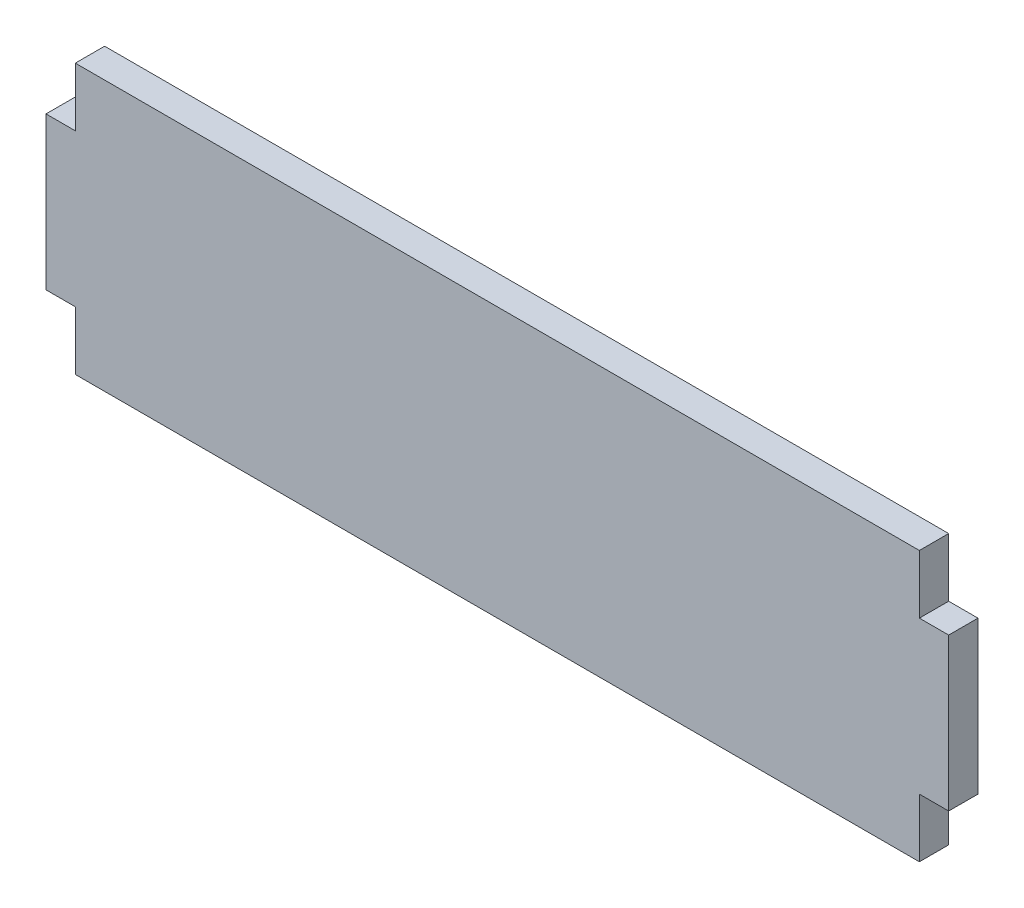
ISO-10303-21;
HEADER;
FILE_DESCRIPTION(('STEP AP214'),'2;1');
FILE_NAME('part.step','',(''),(''),'','','');
FILE_SCHEMA(('AUTOMOTIVE_DESIGN { 1 0 10303 214 1 1 1 1 }'));
ENDSEC;
DATA;
#1=APPLICATION_CONTEXT('core data for automotive mechanical design processes');
#2=APPLICATION_PROTOCOL_DEFINITION('international standard','automotive_design',2000,#1);
#3=PRODUCT_CONTEXT('',#1,'mechanical');
#4=PRODUCT('Part','Part','',(#3));
#5=PRODUCT_RELATED_PRODUCT_CATEGORY('part','',(#4));
#6=PRODUCT_DEFINITION_FORMATION('','',#4);
#7=PRODUCT_DEFINITION_CONTEXT('part definition',#1,'design');
#8=PRODUCT_DEFINITION('design','',#6,#7);
#9=PRODUCT_DEFINITION_SHAPE('','',#8);
#10=(LENGTH_UNIT() NAMED_UNIT(*) SI_UNIT(.MILLI.,.METRE.));
#11=(NAMED_UNIT(*) PLANE_ANGLE_UNIT() SI_UNIT($,.RADIAN.));
#12=(NAMED_UNIT(*) SI_UNIT($,.STERADIAN.) SOLID_ANGLE_UNIT());
#13=UNCERTAINTY_MEASURE_WITH_UNIT(LENGTH_MEASURE(1.E-05),#10,'distance_accuracy_value','');
#14=(GEOMETRIC_REPRESENTATION_CONTEXT(3) GLOBAL_UNCERTAINTY_ASSIGNED_CONTEXT((#13)) GLOBAL_UNIT_ASSIGNED_CONTEXT((#10,
#11,#12)) REPRESENTATION_CONTEXT('',''));
#15=CARTESIAN_POINT('',(0.,0.,0.));
#16=DIRECTION('',(0.,0.,1.));
#17=DIRECTION('',(1.,0.,0.));
#18=AXIS2_PLACEMENT_3D('',#15,#16,#17);
#19=CARTESIAN_POINT('',(-72.,23.,5.));
#20=DIRECTION('',(1.,0.,0.));
#21=DIRECTION('',(0.,0.,-1.));
#22=AXIS2_PLACEMENT_3D('',#19,#20,#21);
#23=PLANE('',#22);
#24=DIRECTION('',(0.,-1.,0.));
#25=VECTOR('',#24,1.);
#26=CARTESIAN_POINT('',(-72.,23.,0.));
#27=LINE('',#26,#25);
#28=CARTESIAN_POINT('',(-72.,23.,0.));
#29=VERTEX_POINT('',#28);
#30=CARTESIAN_POINT('',(-72.,13.,0.));
#31=VERTEX_POINT('',#30);
#32=EDGE_CURVE('E157',#29,#31,#27,.T.);
#33=ORIENTED_EDGE('',*,*,#32,.T.);
#34=DIRECTION('',(0.,0.,-1.));
#35=VECTOR('',#34,1.);
#36=CARTESIAN_POINT('',(-72.,13.,5.));
#37=LINE('',#36,#35);
#38=CARTESIAN_POINT('',(-72.,13.,5.));
#39=VERTEX_POINT('',#38);
#40=EDGE_CURVE('E11',#39,#31,#37,.T.);
#41=ORIENTED_EDGE('',*,*,#40,.F.);
#42=DIRECTION('',(0.,-1.,0.));
#43=VECTOR('',#42,1.);
#44=CARTESIAN_POINT('',(-72.,23.,5.));
#45=LINE('',#44,#43);
#46=CARTESIAN_POINT('',(-72.,23.,5.));
#47=VERTEX_POINT('',#46);
#48=EDGE_CURVE('E179',#47,#39,#45,.T.);
#49=ORIENTED_EDGE('',*,*,#48,.F.);
#50=DIRECTION('',(0.,0.,-1.));
#51=VECTOR('',#50,1.);
#52=CARTESIAN_POINT('',(-72.,23.,5.));
#53=LINE('',#52,#51);
#54=EDGE_CURVE('E153',#47,#29,#53,.T.);
#55=ORIENTED_EDGE('',*,*,#54,.T.);
#56=EDGE_LOOP('',(#33,#41,#49,#55));
#57=FACE_BOUND('',#56,.T.);
#58=ADVANCED_FACE('F37',(#57),#23,.F.);
#59=CARTESIAN_POINT('',(-72.,13.,5.));
#60=DIRECTION('',(0.,-1.,0.));
#61=DIRECTION('',(0.,0.,-1.));
#62=AXIS2_PLACEMENT_3D('',#59,#60,#61);
#63=PLANE('',#62);
#64=DIRECTION('',(-1.,0.,0.));
#65=VECTOR('',#64,1.);
#66=CARTESIAN_POINT('',(-72.,13.,0.));
#67=LINE('',#66,#65);
#68=CARTESIAN_POINT('',(-77.,13.,0.));
#69=VERTEX_POINT('',#68);
#70=EDGE_CURVE('E160',#31,#69,#67,.T.);
#71=ORIENTED_EDGE('',*,*,#70,.T.);
#72=DIRECTION('',(0.,0.,-1.));
#73=VECTOR('',#72,1.);
#74=CARTESIAN_POINT('',(-77.,13.,5.));
#75=LINE('',#74,#73);
#76=CARTESIAN_POINT('',(-77.,13.,5.));
#77=VERTEX_POINT('',#76);
#78=EDGE_CURVE('E45',#77,#69,#75,.T.);
#79=ORIENTED_EDGE('',*,*,#78,.F.);
#80=DIRECTION('',(-1.,0.,0.));
#81=VECTOR('',#80,1.);
#82=CARTESIAN_POINT('',(-72.,13.,5.));
#83=LINE('',#82,#81);
#84=EDGE_CURVE('E108',#39,#77,#83,.T.);
#85=ORIENTED_EDGE('',*,*,#84,.F.);
#86=ORIENTED_EDGE('',*,*,#40,.T.);
#87=EDGE_LOOP('',(#71,#79,#85,#86));
#88=FACE_BOUND('',#87,.T.);
#89=ADVANCED_FACE('F257',(#88),#63,.F.);
#90=CARTESIAN_POINT('',(-77.,13.,5.));
#91=DIRECTION('',(1.,0.,0.));
#92=DIRECTION('',(0.,0.,-1.));
#93=AXIS2_PLACEMENT_3D('',#90,#91,#92);
#94=PLANE('',#93);
#95=DIRECTION('',(0.,-1.,0.));
#96=VECTOR('',#95,1.);
#97=CARTESIAN_POINT('',(-77.,13.,0.));
#98=LINE('',#97,#96);
#99=CARTESIAN_POINT('',(-77.,-13.,0.));
#100=VERTEX_POINT('',#99);
#101=EDGE_CURVE('E162',#69,#100,#98,.T.);
#102=ORIENTED_EDGE('',*,*,#101,.T.);
#103=DIRECTION('',(0.,0.,-1.));
#104=VECTOR('',#103,1.);
#105=CARTESIAN_POINT('',(-77.,-13.,5.));
#106=LINE('',#105,#104);
#107=CARTESIAN_POINT('',(-77.,-13.,5.));
#108=VERTEX_POINT('',#107);
#109=EDGE_CURVE('E198',#108,#100,#106,.T.);
#110=ORIENTED_EDGE('',*,*,#109,.F.);
#111=DIRECTION('',(0.,-1.,0.));
#112=VECTOR('',#111,1.);
#113=CARTESIAN_POINT('',(-77.,13.,5.));
#114=LINE('',#113,#112);
#115=EDGE_CURVE('E206',#77,#108,#114,.T.);
#116=ORIENTED_EDGE('',*,*,#115,.F.);
#117=ORIENTED_EDGE('',*,*,#78,.T.);
#118=EDGE_LOOP('',(#102,#110,#116,#117));
#119=FACE_BOUND('',#118,.T.);
#120=ADVANCED_FACE('F204',(#119),#94,.F.);
#121=CARTESIAN_POINT('',(-77.,-13.,5.));
#122=DIRECTION('',(0.,1.,0.));
#123=DIRECTION('',(0.,0.,1.));
#124=AXIS2_PLACEMENT_3D('',#121,#122,#123);
#125=PLANE('',#124);
#126=DIRECTION('',(1.,0.,0.));
#127=VECTOR('',#126,1.);
#128=CARTESIAN_POINT('',(-77.,-13.,0.));
#129=LINE('',#128,#127);
#130=CARTESIAN_POINT('',(-72.,-13.,0.));
#131=VERTEX_POINT('',#130);
#132=EDGE_CURVE('E164',#100,#131,#129,.T.);
#133=ORIENTED_EDGE('',*,*,#132,.T.);
#134=DIRECTION('',(0.,0.,-1.));
#135=VECTOR('',#134,1.);
#136=CARTESIAN_POINT('',(-72.,-13.,5.));
#137=LINE('',#136,#135);
#138=CARTESIAN_POINT('',(-72.,-13.,5.));
#139=VERTEX_POINT('',#138);
#140=EDGE_CURVE('E195',#139,#131,#137,.T.);
#141=ORIENTED_EDGE('',*,*,#140,.F.);
#142=DIRECTION('',(1.,0.,0.));
#143=VECTOR('',#142,1.);
#144=CARTESIAN_POINT('',(-77.,-13.,5.));
#145=LINE('',#144,#143);
#146=EDGE_CURVE('E224',#108,#139,#145,.T.);
#147=ORIENTED_EDGE('',*,*,#146,.F.);
#148=ORIENTED_EDGE('',*,*,#109,.T.);
#149=EDGE_LOOP('',(#133,#141,#147,#148));
#150=FACE_BOUND('',#149,.T.);
#151=ADVANCED_FACE('F215',(#150),#125,.F.);
#152=CARTESIAN_POINT('',(-72.,-13.,5.));
#153=DIRECTION('',(1.,0.,0.));
#154=DIRECTION('',(0.,0.,-1.));
#155=AXIS2_PLACEMENT_3D('',#152,#153,#154);
#156=PLANE('',#155);
#157=DIRECTION('',(0.,-1.,0.));
#158=VECTOR('',#157,1.);
#159=CARTESIAN_POINT('',(-72.,-13.,0.));
#160=LINE('',#159,#158);
#161=CARTESIAN_POINT('',(-72.,-23.,0.));
#162=VERTEX_POINT('',#161);
#163=EDGE_CURVE('E166',#131,#162,#160,.T.);
#164=ORIENTED_EDGE('',*,*,#163,.T.);
#165=DIRECTION('',(0.,0.,-1.));
#166=VECTOR('',#165,1.);
#167=CARTESIAN_POINT('',(-72.,-23.,5.));
#168=LINE('',#167,#166);
#169=CARTESIAN_POINT('',(-72.,-23.,5.));
#170=VERTEX_POINT('',#169);
#171=EDGE_CURVE('E192',#170,#162,#168,.T.);
#172=ORIENTED_EDGE('',*,*,#171,.F.);
#173=DIRECTION('',(0.,-1.,0.));
#174=VECTOR('',#173,1.);
#175=CARTESIAN_POINT('',(-72.,-13.,5.));
#176=LINE('',#175,#174);
#177=EDGE_CURVE('E221',#139,#170,#176,.T.);
#178=ORIENTED_EDGE('',*,*,#177,.F.);
#179=ORIENTED_EDGE('',*,*,#140,.T.);
#180=EDGE_LOOP('',(#164,#172,#178,#179));
#181=FACE_BOUND('',#180,.T.);
#182=ADVANCED_FACE('F219',(#181),#156,.F.);
#183=CARTESIAN_POINT('',(72.,-23.,5.));
#184=DIRECTION('',(0.,1.,0.));
#185=DIRECTION('',(0.,0.,1.));
#186=AXIS2_PLACEMENT_3D('',#183,#184,#185);
#187=PLANE('',#186);
#188=DIRECTION('',(1.,0.,0.));
#189=VECTOR('',#188,1.);
#190=CARTESIAN_POINT('',(72.,-23.,0.));
#191=LINE('',#190,#189);
#192=CARTESIAN_POINT('',(72.,-23.,0.));
#193=VERTEX_POINT('',#192);
#194=EDGE_CURVE('E168',#162,#193,#191,.T.);
#195=ORIENTED_EDGE('',*,*,#194,.T.);
#196=DIRECTION('',(0.,0.,-1.));
#197=VECTOR('',#196,1.);
#198=CARTESIAN_POINT('',(72.,-23.,5.));
#199=LINE('',#198,#197);
#200=CARTESIAN_POINT('',(72.,-23.,5.));
#201=VERTEX_POINT('',#200);
#202=EDGE_CURVE('E189',#201,#193,#199,.T.);
#203=ORIENTED_EDGE('',*,*,#202,.F.);
#204=DIRECTION('',(1.,0.,0.));
#205=VECTOR('',#204,1.);
#206=CARTESIAN_POINT('',(72.,-23.,5.));
#207=LINE('',#206,#205);
#208=EDGE_CURVE('E223',#170,#201,#207,.T.);
#209=ORIENTED_EDGE('',*,*,#208,.F.);
#210=ORIENTED_EDGE('',*,*,#171,.T.);
#211=EDGE_LOOP('',(#195,#203,#209,#210));
#212=FACE_BOUND('',#211,.T.);
#213=ADVANCED_FACE('F270',(#212),#187,.F.);
#214=CARTESIAN_POINT('',(72.,-13.,5.));
#215=DIRECTION('',(-1.,0.,0.));
#216=DIRECTION('',(0.,0.,1.));
#217=AXIS2_PLACEMENT_3D('',#214,#215,#216);
#218=PLANE('',#217);
#219=DIRECTION('',(0.,1.,0.));
#220=VECTOR('',#219,1.);
#221=CARTESIAN_POINT('',(72.,-13.,0.));
#222=LINE('',#221,#220);
#223=CARTESIAN_POINT('',(72.,-13.,0.));
#224=VERTEX_POINT('',#223);
#225=EDGE_CURVE('E170',#193,#224,#222,.T.);
#226=ORIENTED_EDGE('',*,*,#225,.T.);
#227=DIRECTION('',(0.,0.,-1.));
#228=VECTOR('',#227,1.);
#229=CARTESIAN_POINT('',(72.,-13.,5.));
#230=LINE('',#229,#228);
#231=CARTESIAN_POINT('',(72.,-13.,5.));
#232=VERTEX_POINT('',#231);
#233=EDGE_CURVE('E186',#232,#224,#230,.T.);
#234=ORIENTED_EDGE('',*,*,#233,.F.);
#235=DIRECTION('',(0.,1.,0.));
#236=VECTOR('',#235,1.);
#237=CARTESIAN_POINT('',(72.,-13.,5.));
#238=LINE('',#237,#236);
#239=EDGE_CURVE('E226',#201,#232,#238,.T.);
#240=ORIENTED_EDGE('',*,*,#239,.F.);
#241=ORIENTED_EDGE('',*,*,#202,.T.);
#242=EDGE_LOOP('',(#226,#234,#240,#241));
#243=FACE_BOUND('',#242,.T.);
#244=ADVANCED_FACE('F273',(#243),#218,.F.);
#245=CARTESIAN_POINT('',(77.,-13.,5.));
#246=DIRECTION('',(0.,1.,0.));
#247=DIRECTION('',(0.,0.,1.));
#248=AXIS2_PLACEMENT_3D('',#245,#246,#247);
#249=PLANE('',#248);
#250=DIRECTION('',(1.,0.,0.));
#251=VECTOR('',#250,1.);
#252=CARTESIAN_POINT('',(77.,-13.,0.));
#253=LINE('',#252,#251);
#254=CARTESIAN_POINT('',(77.,-13.,0.));
#255=VERTEX_POINT('',#254);
#256=EDGE_CURVE('E172',#224,#255,#253,.T.);
#257=ORIENTED_EDGE('',*,*,#256,.T.);
#258=DIRECTION('',(0.,0.,-1.));
#259=VECTOR('',#258,1.);
#260=CARTESIAN_POINT('',(77.,-13.,5.));
#261=LINE('',#260,#259);
#262=CARTESIAN_POINT('',(77.,-13.,5.));
#263=VERTEX_POINT('',#262);
#264=EDGE_CURVE('E183',#263,#255,#261,.T.);
#265=ORIENTED_EDGE('',*,*,#264,.F.);
#266=DIRECTION('',(1.,0.,0.));
#267=VECTOR('',#266,1.);
#268=CARTESIAN_POINT('',(77.,-13.,5.));
#269=LINE('',#268,#267);
#270=EDGE_CURVE('E232',#232,#263,#269,.T.);
#271=ORIENTED_EDGE('',*,*,#270,.F.);
#272=ORIENTED_EDGE('',*,*,#233,.T.);
#273=EDGE_LOOP('',(#257,#265,#271,#272));
#274=FACE_BOUND('',#273,.T.);
#275=ADVANCED_FACE('F238',(#274),#249,.F.);
#276=CARTESIAN_POINT('',(77.,13.,5.));
#277=DIRECTION('',(-1.,0.,0.));
#278=DIRECTION('',(0.,0.,1.));
#279=AXIS2_PLACEMENT_3D('',#276,#277,#278);
#280=PLANE('',#279);
#281=DIRECTION('',(0.,1.,0.));
#282=VECTOR('',#281,1.);
#283=CARTESIAN_POINT('',(77.,13.,0.));
#284=LINE('',#283,#282);
#285=CARTESIAN_POINT('',(77.,13.,0.));
#286=VERTEX_POINT('',#285);
#287=EDGE_CURVE('E174',#255,#286,#284,.T.);
#288=ORIENTED_EDGE('',*,*,#287,.T.);
#289=DIRECTION('',(0.,0.,-1.));
#290=VECTOR('',#289,1.);
#291=CARTESIAN_POINT('',(77.,13.,5.));
#292=LINE('',#291,#290);
#293=CARTESIAN_POINT('',(77.,13.,5.));
#294=VERTEX_POINT('',#293);
#295=EDGE_CURVE('E148',#294,#286,#292,.T.);
#296=ORIENTED_EDGE('',*,*,#295,.F.);
#297=DIRECTION('',(0.,1.,0.));
#298=VECTOR('',#297,1.);
#299=CARTESIAN_POINT('',(77.,13.,5.));
#300=LINE('',#299,#298);
#301=EDGE_CURVE('E139',#263,#294,#300,.T.);
#302=ORIENTED_EDGE('',*,*,#301,.F.);
#303=ORIENTED_EDGE('',*,*,#264,.T.);
#304=EDGE_LOOP('',(#288,#296,#302,#303));
#305=FACE_BOUND('',#304,.T.);
#306=ADVANCED_FACE('F242',(#305),#280,.F.);
#307=CARTESIAN_POINT('',(72.,13.,5.));
#308=DIRECTION('',(0.,-1.,0.));
#309=DIRECTION('',(0.,0.,-1.));
#310=AXIS2_PLACEMENT_3D('',#307,#308,#309);
#311=PLANE('',#310);
#312=DIRECTION('',(-1.,0.,0.));
#313=VECTOR('',#312,1.);
#314=CARTESIAN_POINT('',(72.,13.,0.));
#315=LINE('',#314,#313);
#316=CARTESIAN_POINT('',(72.,13.,0.));
#317=VERTEX_POINT('',#316);
#318=EDGE_CURVE('E147',#286,#317,#315,.T.);
#319=ORIENTED_EDGE('',*,*,#318,.T.);
#320=DIRECTION('',(0.,0.,-1.));
#321=VECTOR('',#320,1.);
#322=CARTESIAN_POINT('',(72.,13.,5.));
#323=LINE('',#322,#321);
#324=CARTESIAN_POINT('',(72.,13.,5.));
#325=VERTEX_POINT('',#324);
#326=EDGE_CURVE('E144',#325,#317,#323,.T.);
#327=ORIENTED_EDGE('',*,*,#326,.F.);
#328=DIRECTION('',(-1.,0.,0.));
#329=VECTOR('',#328,1.);
#330=CARTESIAN_POINT('',(72.,13.,5.));
#331=LINE('',#330,#329);
#332=EDGE_CURVE('E133',#294,#325,#331,.T.);
#333=ORIENTED_EDGE('',*,*,#332,.F.);
#334=ORIENTED_EDGE('',*,*,#295,.T.);
#335=EDGE_LOOP('',(#319,#327,#333,#334));
#336=FACE_BOUND('',#335,.T.);
#337=ADVANCED_FACE('F145',(#336),#311,.F.);
#338=CARTESIAN_POINT('',(72.,23.,5.));
#339=DIRECTION('',(-1.,0.,0.));
#340=DIRECTION('',(0.,0.,1.));
#341=AXIS2_PLACEMENT_3D('',#338,#339,#340);
#342=PLANE('',#341);
#343=DIRECTION('',(0.,1.,0.));
#344=VECTOR('',#343,1.);
#345=CARTESIAN_POINT('',(72.,23.,0.));
#346=LINE('',#345,#344);
#347=CARTESIAN_POINT('',(72.,23.,0.));
#348=VERTEX_POINT('',#347);
#349=EDGE_CURVE('E94',#317,#348,#346,.T.);
#350=ORIENTED_EDGE('',*,*,#349,.T.);
#351=DIRECTION('',(0.,0.,-1.));
#352=VECTOR('',#351,1.);
#353=CARTESIAN_POINT('',(72.,23.,5.));
#354=LINE('',#353,#352);
#355=CARTESIAN_POINT('',(72.,23.,5.));
#356=VERTEX_POINT('',#355);
#357=EDGE_CURVE('E149',#356,#348,#354,.T.);
#358=ORIENTED_EDGE('',*,*,#357,.F.);
#359=DIRECTION('',(0.,1.,0.));
#360=VECTOR('',#359,1.);
#361=CARTESIAN_POINT('',(72.,23.,5.));
#362=LINE('',#361,#360);
#363=EDGE_CURVE('E137',#325,#356,#362,.T.);
#364=ORIENTED_EDGE('',*,*,#363,.F.);
#365=ORIENTED_EDGE('',*,*,#326,.T.);
#366=EDGE_LOOP('',(#350,#358,#364,#365));
#367=FACE_BOUND('',#366,.T.);
#368=ADVANCED_FACE('F151',(#367),#342,.F.);
#369=CARTESIAN_POINT('',(-72.,23.,5.));
#370=DIRECTION('',(0.,-1.,0.));
#371=DIRECTION('',(0.,0.,-1.));
#372=AXIS2_PLACEMENT_3D('',#369,#370,#371);
#373=PLANE('',#372);
#374=DIRECTION('',(-1.,0.,0.));
#375=VECTOR('',#374,1.);
#376=CARTESIAN_POINT('',(-72.,23.,0.));
#377=LINE('',#376,#375);
#378=EDGE_CURVE('E100',#348,#29,#377,.T.);
#379=ORIENTED_EDGE('',*,*,#378,.T.);
#380=ORIENTED_EDGE('',*,*,#54,.F.);
#381=DIRECTION('',(-1.,0.,0.));
#382=VECTOR('',#381,1.);
#383=CARTESIAN_POINT('',(-72.,23.,5.));
#384=LINE('',#383,#382);
#385=EDGE_CURVE('E53',#356,#47,#384,.T.);
#386=ORIENTED_EDGE('',*,*,#385,.F.);
#387=ORIENTED_EDGE('',*,*,#357,.T.);
#388=EDGE_LOOP('',(#379,#380,#386,#387));
#389=FACE_BOUND('',#388,.T.);
#390=ADVANCED_FACE('F246',(#389),#373,.F.);
#391=CARTESIAN_POINT('',(0.,0.,5.));
#392=DIRECTION('',(0.,0.,-1.));
#393=DIRECTION('',(-1.,0.,0.));
#394=AXIS2_PLACEMENT_3D('',#391,#392,#393);
#395=PLANE('',#394);
#396=ORIENTED_EDGE('',*,*,#48,.T.);
#397=ORIENTED_EDGE('',*,*,#84,.T.);
#398=ORIENTED_EDGE('',*,*,#115,.T.);
#399=ORIENTED_EDGE('',*,*,#146,.T.);
#400=ORIENTED_EDGE('',*,*,#177,.T.);
#401=ORIENTED_EDGE('',*,*,#208,.T.);
#402=ORIENTED_EDGE('',*,*,#239,.T.);
#403=ORIENTED_EDGE('',*,*,#270,.T.);
#404=ORIENTED_EDGE('',*,*,#301,.T.);
#405=ORIENTED_EDGE('',*,*,#332,.T.);
#406=ORIENTED_EDGE('',*,*,#363,.T.);
#407=ORIENTED_EDGE('',*,*,#385,.T.);
#408=EDGE_LOOP('',(#396,#397,#398,#399,#400,#401,#402,#403,#404,#405,#406,#407));
#409=FACE_BOUND('',#408,.T.);
#410=ADVANCED_FACE('F135',(#409),#395,.F.);
#411=CARTESIAN_POINT('',(0.,0.,0.));
#412=DIRECTION('',(0.,0.,-1.));
#413=DIRECTION('',(-1.,0.,0.));
#414=AXIS2_PLACEMENT_3D('',#411,#412,#413);
#415=PLANE('',#414);
#416=ORIENTED_EDGE('',*,*,#32,.F.);
#417=ORIENTED_EDGE('',*,*,#378,.F.);
#418=ORIENTED_EDGE('',*,*,#349,.F.);
#419=ORIENTED_EDGE('',*,*,#318,.F.);
#420=ORIENTED_EDGE('',*,*,#287,.F.);
#421=ORIENTED_EDGE('',*,*,#256,.F.);
#422=ORIENTED_EDGE('',*,*,#225,.F.);
#423=ORIENTED_EDGE('',*,*,#194,.F.);
#424=ORIENTED_EDGE('',*,*,#163,.F.);
#425=ORIENTED_EDGE('',*,*,#132,.F.);
#426=ORIENTED_EDGE('',*,*,#101,.F.);
#427=ORIENTED_EDGE('',*,*,#70,.F.);
#428=EDGE_LOOP('',(#416,#417,#418,#419,#420,#421,#422,#423,#424,#425,#426,#427));
#429=FACE_BOUND('',#428,.T.);
#430=ADVANCED_FACE('F210',(#429),#415,.T.);
#431=CLOSED_SHELL('',(#58,#89,#120,#151,#182,#213,#244,#275,#306,#337,#368,#390,#410,#430));
#432=MANIFOLD_SOLID_BREP('B2',#431);
#433=ADVANCED_BREP_SHAPE_REPRESENTATION('',(#18,#432),#14);
#434=SHAPE_DEFINITION_REPRESENTATION(#9,#433);
ENDSEC;
END-ISO-10303-21;
